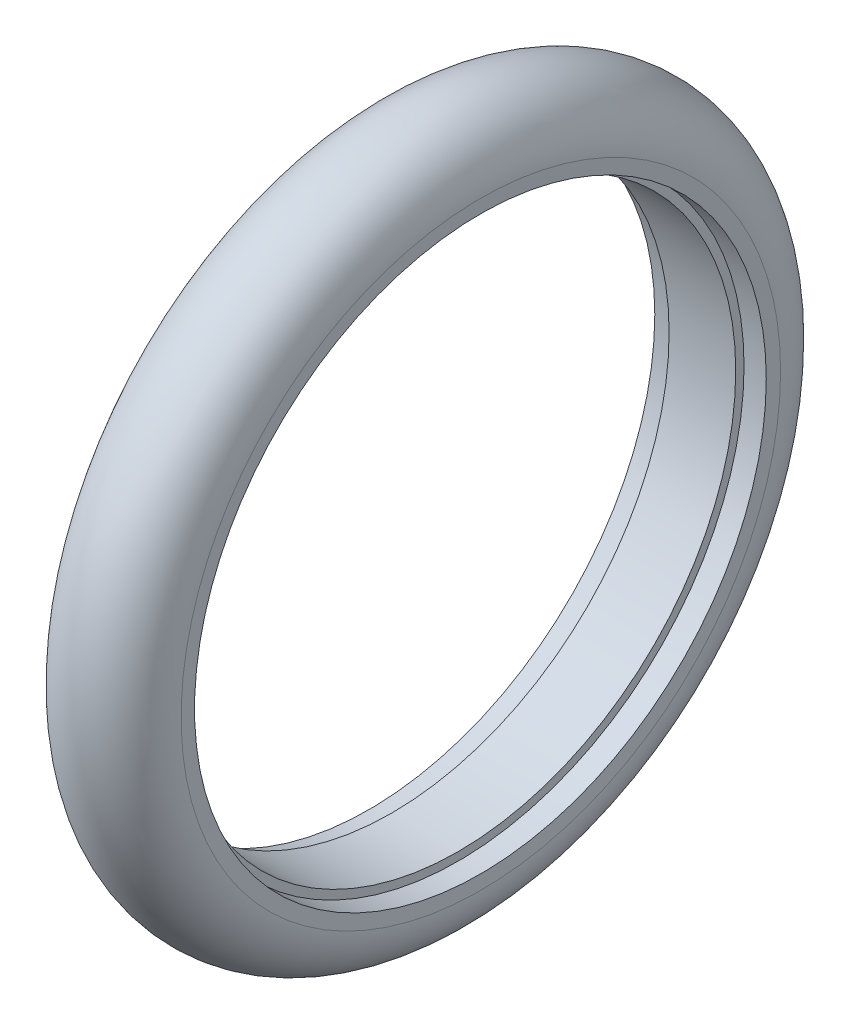
ISO-10303-21;
HEADER;
FILE_DESCRIPTION(('STEP AP214'),'2;1');
FILE_NAME('part.step','',(''),(''),'','','');
FILE_SCHEMA(('AUTOMOTIVE_DESIGN { 1 0 10303 214 1 1 1 1 }'));
ENDSEC;
DATA;
#1=APPLICATION_CONTEXT('core data for automotive mechanical design processes');
#2=APPLICATION_PROTOCOL_DEFINITION('international standard','automotive_design',2000,#1);
#3=PRODUCT_CONTEXT('',#1,'mechanical');
#4=PRODUCT('Part','Part','',(#3));
#5=PRODUCT_RELATED_PRODUCT_CATEGORY('part','',(#4));
#6=PRODUCT_DEFINITION_FORMATION('','',#4);
#7=PRODUCT_DEFINITION_CONTEXT('part definition',#1,'design');
#8=PRODUCT_DEFINITION('design','',#6,#7);
#9=PRODUCT_DEFINITION_SHAPE('','',#8);
#10=(LENGTH_UNIT() NAMED_UNIT(*) SI_UNIT(.MILLI.,.METRE.));
#11=(NAMED_UNIT(*) PLANE_ANGLE_UNIT() SI_UNIT($,.RADIAN.));
#12=(NAMED_UNIT(*) SI_UNIT($,.STERADIAN.) SOLID_ANGLE_UNIT());
#13=UNCERTAINTY_MEASURE_WITH_UNIT(LENGTH_MEASURE(1.E-05),#10,'distance_accuracy_value','');
#14=(GEOMETRIC_REPRESENTATION_CONTEXT(3) GLOBAL_UNCERTAINTY_ASSIGNED_CONTEXT((#13)) GLOBAL_UNIT_ASSIGNED_CONTEXT((#10,
#11,#12)) REPRESENTATION_CONTEXT('',''));
#15=CARTESIAN_POINT('',(0.,0.,0.));
#16=DIRECTION('',(0.,0.,1.));
#17=DIRECTION('',(1.,0.,0.));
#18=AXIS2_PLACEMENT_3D('',#15,#16,#17);
#19=CARTESIAN_POINT('',(0.,0.,0.));
#20=DIRECTION('',(1.,0.,0.));
#21=DIRECTION('',(0.,0.,-1.));
#22=AXIS2_PLACEMENT_3D('',#19,#20,#21);
#23=TOROIDAL_SURFACE('',#22,108.,20.1625);
#24=CARTESIAN_POINT('',(-20.1625,0.,0.));
#25=DIRECTION('',(1.,0.,0.));
#26=DIRECTION('',(0.,0.,-1.));
#27=AXIS2_PLACEMENT_3D('',#24,#25,#26);
#28=CIRCLE('',#27,108.);
#29=CARTESIAN_POINT('',(-20.1625,0.,-108.));
#30=VERTEX_POINT('',#29);
#31=EDGE_CURVE('E10',#30,#30,#28,.T.);
#32=ORIENTED_EDGE('',*,*,#31,.T.);
#33=EDGE_LOOP('',(#32));
#34=FACE_BOUND('',#33,.T.);
#35=CARTESIAN_POINT('',(20.1625,0.,0.));
#36=DIRECTION('',(1.,0.,0.));
#37=DIRECTION('',(0.,0.,-1.));
#38=AXIS2_PLACEMENT_3D('',#35,#36,#37);
#39=CIRCLE('',#38,108.);
#40=CARTESIAN_POINT('',(20.1625,0.,-108.));
#41=VERTEX_POINT('',#40);
#42=EDGE_CURVE('E64',#41,#41,#39,.T.);
#43=ORIENTED_EDGE('',*,*,#42,.F.);
#44=EDGE_LOOP('',(#43));
#45=FACE_BOUND('',#44,.T.);
#46=ADVANCED_FACE('F35',(#34,#45),#23,.T.);
#47=CARTESIAN_POINT('',(-20.1625,108.,0.));
#48=DIRECTION('',(-1.,0.,0.));
#49=DIRECTION('',(0.,0.,1.));
#50=AXIS2_PLACEMENT_3D('',#47,#48,#49);
#51=PLANE('',#50);
#52=CARTESIAN_POINT('',(-20.1625,0.,0.));
#53=DIRECTION('',(1.,0.,0.));
#54=DIRECTION('',(0.,0.,-1.));
#55=AXIS2_PLACEMENT_3D('',#52,#53,#54);
#56=CIRCLE('',#55,103.);
#57=CARTESIAN_POINT('',(-20.1625,0.,-103.));
#58=VERTEX_POINT('',#57);
#59=EDGE_CURVE('E41',#58,#58,#56,.T.);
#60=ORIENTED_EDGE('',*,*,#59,.T.);
#61=EDGE_LOOP('',(#60));
#62=FACE_BOUND('',#61,.T.);
#63=ORIENTED_EDGE('',*,*,#31,.F.);
#64=EDGE_LOOP('',(#63));
#65=FACE_BOUND('',#64,.T.);
#66=ADVANCED_FACE('F73',(#62,#65),#51,.T.);
#67=CARTESIAN_POINT('',(88.99,0.,0.));
#68=DIRECTION('',(1.,0.,0.));
#69=DIRECTION('',(0.,0.,-1.));
#70=AXIS2_PLACEMENT_3D('',#67,#68,#69);
#71=CYLINDRICAL_SURFACE('',#70,103.);
#72=CARTESIAN_POINT('',(-12.,0.,0.));
#73=DIRECTION('',(1.,0.,0.));
#74=DIRECTION('',(0.,0.,-1.));
#75=AXIS2_PLACEMENT_3D('',#72,#73,#74);
#76=CIRCLE('',#75,103.);
#77=CARTESIAN_POINT('',(-12.,0.,-103.));
#78=VERTEX_POINT('',#77);
#79=EDGE_CURVE('E45',#78,#78,#76,.T.);
#80=ORIENTED_EDGE('',*,*,#79,.T.);
#81=EDGE_LOOP('',(#80));
#82=FACE_BOUND('',#81,.T.);
#83=ORIENTED_EDGE('',*,*,#59,.F.);
#84=EDGE_LOOP('',(#83));
#85=FACE_BOUND('',#84,.T.);
#86=ADVANCED_FACE('F77',(#82,#85),#71,.F.);
#87=CARTESIAN_POINT('',(-12.,103.,0.));
#88=DIRECTION('',(-1.,0.,0.));
#89=DIRECTION('',(0.,0.,1.));
#90=AXIS2_PLACEMENT_3D('',#87,#88,#89);
#91=PLANE('',#90);
#92=CARTESIAN_POINT('',(-12.,0.,0.));
#93=DIRECTION('',(1.,0.,0.));
#94=DIRECTION('',(0.,0.,-1.));
#95=AXIS2_PLACEMENT_3D('',#92,#93,#94);
#96=CIRCLE('',#95,100.);
#97=CARTESIAN_POINT('',(-12.,0.,-100.));
#98=VERTEX_POINT('',#97);
#99=EDGE_CURVE('E49',#98,#98,#96,.T.);
#100=ORIENTED_EDGE('',*,*,#99,.T.);
#101=EDGE_LOOP('',(#100));
#102=FACE_BOUND('',#101,.T.);
#103=ORIENTED_EDGE('',*,*,#79,.F.);
#104=EDGE_LOOP('',(#103));
#105=FACE_BOUND('',#104,.T.);
#106=ADVANCED_FACE('F81',(#102,#105),#91,.T.);
#107=CARTESIAN_POINT('',(88.99,0.,0.));
#108=DIRECTION('',(1.,0.,0.));
#109=DIRECTION('',(0.,0.,-1.));
#110=AXIS2_PLACEMENT_3D('',#107,#108,#109);
#111=CYLINDRICAL_SURFACE('',#110,100.);
#112=CARTESIAN_POINT('',(12.,0.,0.));
#113=DIRECTION('',(1.,0.,0.));
#114=DIRECTION('',(0.,0.,-1.));
#115=AXIS2_PLACEMENT_3D('',#112,#113,#114);
#116=CIRCLE('',#115,100.);
#117=CARTESIAN_POINT('',(12.,0.,-100.));
#118=VERTEX_POINT('',#117);
#119=EDGE_CURVE('E54',#118,#118,#116,.T.);
#120=ORIENTED_EDGE('',*,*,#119,.T.);
#121=EDGE_LOOP('',(#120));
#122=FACE_BOUND('',#121,.T.);
#123=ORIENTED_EDGE('',*,*,#99,.F.);
#124=EDGE_LOOP('',(#123));
#125=FACE_BOUND('',#124,.T.);
#126=ADVANCED_FACE('F88',(#122,#125),#111,.F.);
#127=CARTESIAN_POINT('',(12.,103.,0.));
#128=DIRECTION('',(1.,0.,0.));
#129=DIRECTION('',(0.,0.,-1.));
#130=AXIS2_PLACEMENT_3D('',#127,#128,#129);
#131=PLANE('',#130);
#132=CARTESIAN_POINT('',(12.,0.,0.));
#133=DIRECTION('',(1.,0.,0.));
#134=DIRECTION('',(0.,0.,-1.));
#135=AXIS2_PLACEMENT_3D('',#132,#133,#134);
#136=CIRCLE('',#135,103.);
#137=CARTESIAN_POINT('',(12.,0.,-103.));
#138=VERTEX_POINT('',#137);
#139=EDGE_CURVE('E57',#138,#138,#136,.T.);
#140=ORIENTED_EDGE('',*,*,#139,.T.);
#141=EDGE_LOOP('',(#140));
#142=FACE_BOUND('',#141,.T.);
#143=ORIENTED_EDGE('',*,*,#119,.F.);
#144=EDGE_LOOP('',(#143));
#145=FACE_BOUND('',#144,.T.);
#146=ADVANCED_FACE('F92',(#142,#145),#131,.T.);
#147=CARTESIAN_POINT('',(88.99,0.,0.));
#148=DIRECTION('',(1.,0.,0.));
#149=DIRECTION('',(0.,0.,-1.));
#150=AXIS2_PLACEMENT_3D('',#147,#148,#149);
#151=CYLINDRICAL_SURFACE('',#150,103.);
#152=CARTESIAN_POINT('',(20.,0.,0.));
#153=DIRECTION('',(1.,0.,0.));
#154=DIRECTION('',(0.,0.,-1.));
#155=AXIS2_PLACEMENT_3D('',#152,#153,#154);
#156=CIRCLE('',#155,103.);
#157=CARTESIAN_POINT('',(20.,0.,-103.));
#158=VERTEX_POINT('',#157);
#159=EDGE_CURVE('E61',#158,#158,#156,.T.);
#160=ORIENTED_EDGE('',*,*,#159,.T.);
#161=EDGE_LOOP('',(#160));
#162=FACE_BOUND('',#161,.T.);
#163=ORIENTED_EDGE('',*,*,#139,.F.);
#164=EDGE_LOOP('',(#163));
#165=FACE_BOUND('',#164,.T.);
#166=ADVANCED_FACE('F96',(#162,#165),#151,.F.);
#167=CARTESIAN_POINT('',(20.,0.,0.));
#168=DIRECTION('',(1.,0.,0.));
#169=DIRECTION('',(0.,0.,-1.));
#170=AXIS2_PLACEMENT_3D('',#167,#168,#169);
#171=CONICAL_SURFACE('',#170,103.,1.53830776225688);
#172=ORIENTED_EDGE('',*,*,#42,.T.);
#173=EDGE_LOOP('',(#172));
#174=FACE_BOUND('',#173,.T.);
#175=ORIENTED_EDGE('',*,*,#159,.F.);
#176=EDGE_LOOP('',(#175));
#177=FACE_BOUND('',#176,.T.);
#178=ADVANCED_FACE('F69',(#174,#177),#171,.F.);
#179=CLOSED_SHELL('',(#46,#66,#86,#106,#126,#146,#166,#178));
#180=MANIFOLD_SOLID_BREP('B2',#179);
#181=ADVANCED_BREP_SHAPE_REPRESENTATION('',(#18,#180),#14);
#182=SHAPE_DEFINITION_REPRESENTATION(#9,#181);
ENDSEC;
END-ISO-10303-21;
